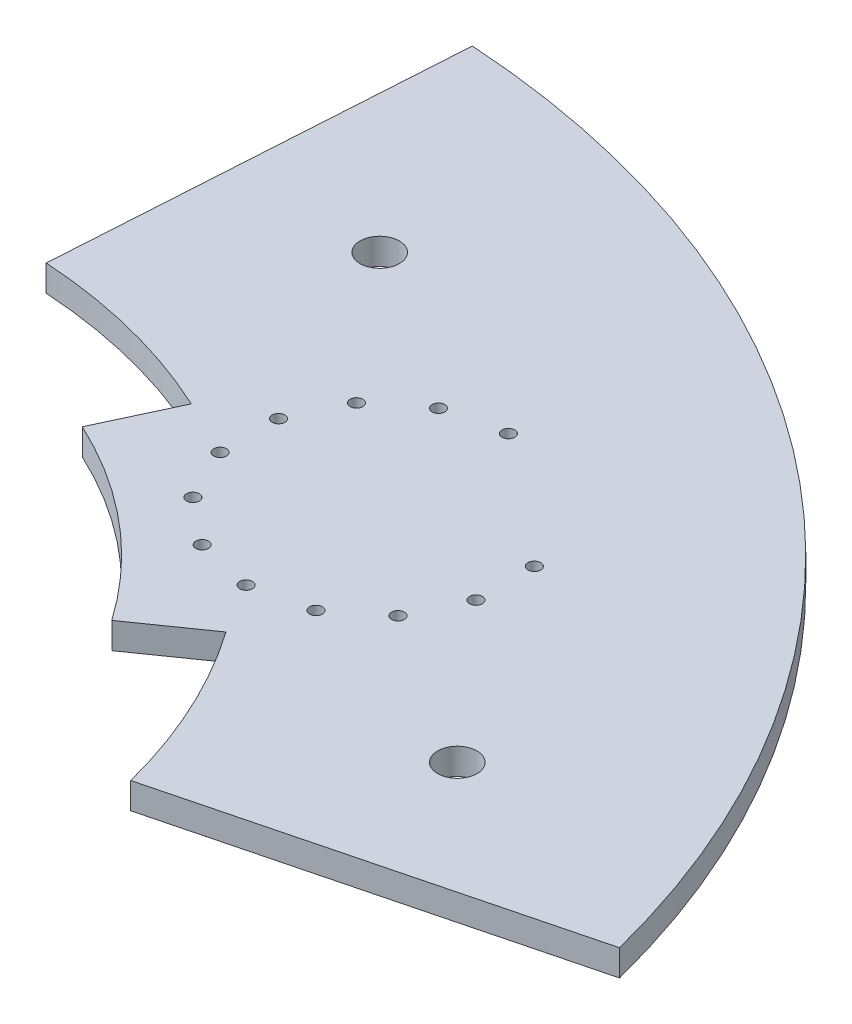
ISO-10303-21;
HEADER;
FILE_DESCRIPTION(('STEP AP214'),'2;1');
FILE_NAME('part.step','',(''),(''),'','','');
FILE_SCHEMA(('AUTOMOTIVE_DESIGN { 1 0 10303 214 1 1 1 1 }'));
ENDSEC;
DATA;
#1=APPLICATION_CONTEXT('core data for automotive mechanical design processes');
#2=APPLICATION_PROTOCOL_DEFINITION('international standard','automotive_design',2000,#1);
#3=PRODUCT_CONTEXT('',#1,'mechanical');
#4=PRODUCT('Part','Part','',(#3));
#5=PRODUCT_RELATED_PRODUCT_CATEGORY('part','',(#4));
#6=PRODUCT_DEFINITION_FORMATION('','',#4);
#7=PRODUCT_DEFINITION_CONTEXT('part definition',#1,'design');
#8=PRODUCT_DEFINITION('design','',#6,#7);
#9=PRODUCT_DEFINITION_SHAPE('','',#8);
#10=(LENGTH_UNIT() NAMED_UNIT(*) SI_UNIT(.MILLI.,.METRE.));
#11=(NAMED_UNIT(*) PLANE_ANGLE_UNIT() SI_UNIT($,.RADIAN.));
#12=(NAMED_UNIT(*) SI_UNIT($,.STERADIAN.) SOLID_ANGLE_UNIT());
#13=UNCERTAINTY_MEASURE_WITH_UNIT(LENGTH_MEASURE(1.E-05),#10,'distance_accuracy_value','');
#14=(GEOMETRIC_REPRESENTATION_CONTEXT(3) GLOBAL_UNCERTAINTY_ASSIGNED_CONTEXT((#13)) GLOBAL_UNIT_ASSIGNED_CONTEXT((#10,
#11,#12)) REPRESENTATION_CONTEXT('',''));
#15=CARTESIAN_POINT('',(0.,0.,0.));
#16=DIRECTION('',(0.,0.,1.));
#17=DIRECTION('',(1.,0.,0.));
#18=AXIS2_PLACEMENT_3D('',#15,#16,#17);
#19=CARTESIAN_POINT('',(-171.367875976404,1.6,83.6023855430664));
#20=DIRECTION('',(-0.247912182794819,0.,-0.968782508936814));
#21=DIRECTION('',(-0.968782508936814,0.,0.247912182794819));
#22=AXIS2_PLACEMENT_3D('',#19,#20,#21);
#23=PLANE('',#22);
#24=DIRECTION('',(0.968782508936814,0.,-0.247912182794819));
#25=VECTOR('',#24,1.);
#26=CARTESIAN_POINT('',(-171.367875976404,0.,83.6023855430664));
#27=LINE('',#26,#25);
#28=CARTESIAN_POINT('',(15.5239323843186,0.,35.7766292667422));
#29=VERTEX_POINT('',#28);
#30=CARTESIAN_POINT('',(39.2591038532706,0.,29.7027807882692));
#31=VERTEX_POINT('',#30);
#32=EDGE_CURVE('E133',#29,#31,#27,.T.);
#33=ORIENTED_EDGE('',*,*,#32,.T.);
#34=DIRECTION('',(0.,-1.,0.));
#35=VECTOR('',#34,1.);
#36=CARTESIAN_POINT('',(39.2591038532706,1.6,29.7027807882692));
#37=LINE('',#36,#35);
#38=CARTESIAN_POINT('',(39.2591038532706,1.6,29.7027807882692));
#39=VERTEX_POINT('',#38);
#40=EDGE_CURVE('E11',#39,#31,#37,.T.);
#41=ORIENTED_EDGE('',*,*,#40,.F.);
#42=DIRECTION('',(0.968782508936814,0.,-0.247912182794819));
#43=VECTOR('',#42,1.);
#44=CARTESIAN_POINT('',(-171.367875976404,1.6,83.6023855430664));
#45=LINE('',#44,#43);
#46=CARTESIAN_POINT('',(15.5239323843186,1.6,35.7766292667422));
#47=VERTEX_POINT('',#46);
#48=EDGE_CURVE('E154',#47,#39,#45,.T.);
#49=ORIENTED_EDGE('',*,*,#48,.F.);
#50=DIRECTION('',(0.,-1.,0.));
#51=VECTOR('',#50,1.);
#52=CARTESIAN_POINT('',(15.5239323843186,1.6,35.7766292667422));
#53=LINE('',#52,#51);
#54=EDGE_CURVE('E52',#47,#29,#53,.T.);
#55=ORIENTED_EDGE('',*,*,#54,.T.);
#56=EDGE_LOOP('',(#33,#41,#49,#55));
#57=FACE_BOUND('',#56,.T.);
#58=ADVANCED_FACE('F34',(#57),#23,.F.);
#59=CARTESIAN_POINT('',(-16.4458904105962,1.6,43.9577312989713));
#60=DIRECTION('',(0.,-1.,0.));
#61=DIRECTION('',(0.,0.,-1.));
#62=AXIS2_PLACEMENT_3D('',#59,#60,#61);
#63=CYLINDRICAL_SURFACE('',#62,57.5);
#64=CARTESIAN_POINT('',(-16.4458904105962,0.,43.9577312989713));
#65=DIRECTION('',(0.,1.,0.));
#66=DIRECTION('',(0.,0.,1.));
#67=AXIS2_PLACEMENT_3D('',#64,#65,#66);
#68=CIRCLE('',#67,57.5);
#69=CARTESIAN_POINT('',(-12.8492863399196,0.,-13.4296753261655));
#70=VERTEX_POINT('',#69);
#71=EDGE_CURVE('E135',#31,#70,#68,.T.);
#72=ORIENTED_EDGE('',*,*,#71,.T.);
#73=DIRECTION('',(0.,-1.,0.));
#74=VECTOR('',#73,1.);
#75=CARTESIAN_POINT('',(-12.8492863399196,1.6,-13.4296753261655));
#76=LINE('',#75,#74);
#77=CARTESIAN_POINT('',(-12.8492863399196,1.6,-13.4296753261655));
#78=VERTEX_POINT('',#77);
#79=EDGE_CURVE('E43',#78,#70,#76,.T.);
#80=ORIENTED_EDGE('',*,*,#79,.F.);
#81=CARTESIAN_POINT('',(-16.4458904105962,1.6,43.9577312989713));
#82=DIRECTION('',(0.,1.,0.));
#83=DIRECTION('',(0.,0.,1.));
#84=AXIS2_PLACEMENT_3D('',#81,#82,#83);
#85=CIRCLE('',#84,57.5);
#86=EDGE_CURVE('E90',#39,#78,#85,.T.);
#87=ORIENTED_EDGE('',*,*,#86,.F.);
#88=ORIENTED_EDGE('',*,*,#40,.T.);
#89=EDGE_LOOP('',(#72,#80,#87,#88));
#90=FACE_BOUND('',#89,.T.);
#91=ADVANCED_FACE('F272',(#90),#63,.T.);
#92=CARTESIAN_POINT('',(-11.6697764428041,1.6,-32.2499326450113));
#93=DIRECTION('',(-0.998041854350205,0.,-0.0625496360117667));
#94=DIRECTION('',(-0.0625496360117667,0.,0.998041854350205));
#95=AXIS2_PLACEMENT_3D('',#92,#93,#94);
#96=PLANE('',#95);
#97=DIRECTION('',(0.0625496360117667,0.,-0.998041854350205));
#98=VECTOR('',#97,1.);
#99=CARTESIAN_POINT('',(-11.6697764428041,0.,-32.2499326450113));
#100=LINE('',#99,#98);
#101=CARTESIAN_POINT('',(-14.3817524222079,0.,11.0223501054145));
#102=VERTEX_POINT('',#101);
#103=EDGE_CURVE('E139',#102,#70,#100,.T.);
#104=ORIENTED_EDGE('',*,*,#103,.F.);
#105=DIRECTION('',(0.,-1.,0.));
#106=VECTOR('',#105,1.);
#107=CARTESIAN_POINT('',(-14.3817524222079,1.6,11.0223501054145));
#108=LINE('',#107,#106);
#109=CARTESIAN_POINT('',(-14.3817524222079,1.6,11.0223501054145));
#110=VERTEX_POINT('',#109);
#111=EDGE_CURVE('E160',#110,#102,#108,.T.);
#112=ORIENTED_EDGE('',*,*,#111,.F.);
#113=DIRECTION('',(0.0625496360117667,0.,-0.998041854350205));
#114=VECTOR('',#113,1.);
#115=CARTESIAN_POINT('',(-11.6697764428041,1.6,-32.2499326450113));
#116=LINE('',#115,#114);
#117=EDGE_CURVE('E249',#110,#78,#116,.T.);
#118=ORIENTED_EDGE('',*,*,#117,.T.);
#119=ORIENTED_EDGE('',*,*,#79,.T.);
#120=EDGE_LOOP('',(#104,#112,#118,#119));
#121=FACE_BOUND('',#120,.T.);
#122=ADVANCED_FACE('F276',(#121),#96,.T.);
#123=CARTESIAN_POINT('',(-16.4458904105962,1.6,43.9577312989713));
#124=DIRECTION('',(0.,-1.,0.));
#125=DIRECTION('',(0.,0.,-1.));
#126=AXIS2_PLACEMENT_3D('',#123,#124,#125);
#127=CYLINDRICAL_SURFACE('',#126,33.);
#128=CARTESIAN_POINT('',(-16.4458904105962,0.,43.9577312989713));
#129=DIRECTION('',(0.,1.,0.));
#130=DIRECTION('',(0.,0.,1.));
#131=AXIS2_PLACEMENT_3D('',#128,#129,#130);
#132=CIRCLE('',#131,33.);
#133=CARTESIAN_POINT('',(-2.52245469045661,0.,14.0388754092963));
#134=VERTEX_POINT('',#133);
#135=EDGE_CURVE('E142',#134,#102,#132,.T.);
#136=ORIENTED_EDGE('',*,*,#135,.F.);
#137=DIRECTION('',(0.,-1.,0.));
#138=VECTOR('',#137,1.);
#139=CARTESIAN_POINT('',(-2.52245469045661,1.6,14.0388754092963));
#140=LINE('',#139,#138);
#141=CARTESIAN_POINT('',(-2.52245469045661,1.6,14.0388754092963));
#142=VERTEX_POINT('',#141);
#143=EDGE_CURVE('E158',#142,#134,#140,.T.);
#144=ORIENTED_EDGE('',*,*,#143,.F.);
#145=CARTESIAN_POINT('',(-16.4458904105962,1.6,43.9577312989713));
#146=DIRECTION('',(0.,1.,0.));
#147=DIRECTION('',(0.,0.,1.));
#148=AXIS2_PLACEMENT_3D('',#145,#146,#147);
#149=CIRCLE('',#148,33.);
#150=EDGE_CURVE('E252',#142,#110,#149,.T.);
#151=ORIENTED_EDGE('',*,*,#150,.T.);
#152=ORIENTED_EDGE('',*,*,#111,.T.);
#153=EDGE_LOOP('',(#136,#144,#151,#152));
#154=FACE_BOUND('',#153,.T.);
#155=ADVANCED_FACE('F282',(#154),#127,.F.);
#156=CARTESIAN_POINT('',(-16.0869998536748,1.6,43.1865427023831));
#157=DIRECTION('',(-0.906631996656817,0.,-0.421922294549687));
#158=DIRECTION('',(-0.421922294549688,0.,0.906631996656817));
#159=AXIS2_PLACEMENT_3D('',#156,#157,#158);
#160=PLANE('',#159);
#161=DIRECTION('',(0.421922294549688,0.,-0.906631996656817));
#162=VECTOR('',#161,1.);
#163=CARTESIAN_POINT('',(-16.0869998536748,0.,43.1865427023831));
#164=LINE('',#163,#162);
#165=CARTESIAN_POINT('',(-4.63206616320501,0.,18.5720353925804));
#166=VERTEX_POINT('',#165);
#167=EDGE_CURVE('E145',#166,#134,#164,.T.);
#168=ORIENTED_EDGE('',*,*,#167,.F.);
#169=DIRECTION('',(0.,-1.,0.));
#170=VECTOR('',#169,1.);
#171=CARTESIAN_POINT('',(-4.63206616320501,1.6,18.5720353925804));
#172=LINE('',#171,#170);
#173=CARTESIAN_POINT('',(-4.63206616320501,1.6,18.5720353925804));
#174=VERTEX_POINT('',#173);
#175=EDGE_CURVE('E115',#174,#166,#172,.T.);
#176=ORIENTED_EDGE('',*,*,#175,.F.);
#177=DIRECTION('',(0.421922294549688,0.,-0.906631996656817));
#178=VECTOR('',#177,1.);
#179=CARTESIAN_POINT('',(-16.0869998536748,1.6,43.1865427023831));
#180=LINE('',#179,#178);
#181=EDGE_CURVE('E125',#174,#142,#180,.T.);
#182=ORIENTED_EDGE('',*,*,#181,.T.);
#183=ORIENTED_EDGE('',*,*,#143,.T.);
#184=EDGE_LOOP('',(#168,#176,#182,#183));
#185=FACE_BOUND('',#184,.T.);
#186=ADVANCED_FACE('F256',(#185),#160,.T.);
#187=CARTESIAN_POINT('',(-16.4458904105962,1.6,43.9577312989713));
#188=DIRECTION('',(0.,-1.,0.));
#189=DIRECTION('',(0.,0.,-1.));
#190=AXIS2_PLACEMENT_3D('',#187,#188,#189);
#191=CYLINDRICAL_SURFACE('',#190,28.);
#192=CARTESIAN_POINT('',(-16.4458904105962,0.,43.9577312989713));
#193=DIRECTION('',(0.,1.,0.));
#194=DIRECTION('',(0.,0.,1.));
#195=AXIS2_PLACEMENT_3D('',#192,#193,#194);
#196=CIRCLE('',#195,28.);
#197=CARTESIAN_POINT('',(6.49036682949548,0.,27.897591081142));
#198=VERTEX_POINT('',#197);
#199=EDGE_CURVE('E111',#198,#166,#196,.T.);
#200=ORIENTED_EDGE('',*,*,#199,.F.);
#201=DIRECTION('',(0.,-1.,0.));
#202=VECTOR('',#201,1.);
#203=CARTESIAN_POINT('',(6.49036682949548,1.6,27.897591081142));
#204=LINE('',#203,#202);
#205=CARTESIAN_POINT('',(6.49036682949548,1.6,27.897591081142));
#206=VERTEX_POINT('',#205);
#207=EDGE_CURVE('E106',#206,#198,#204,.T.);
#208=ORIENTED_EDGE('',*,*,#207,.F.);
#209=CARTESIAN_POINT('',(-16.4458904105962,1.6,43.9577312989713));
#210=DIRECTION('',(0.,1.,0.));
#211=DIRECTION('',(0.,0.,1.));
#212=AXIS2_PLACEMENT_3D('',#209,#210,#211);
#213=CIRCLE('',#212,28.);
#214=EDGE_CURVE('E109',#206,#174,#213,.T.);
#215=ORIENTED_EDGE('',*,*,#214,.T.);
#216=ORIENTED_EDGE('',*,*,#175,.T.);
#217=EDGE_LOOP('',(#200,#208,#215,#216));
#218=FACE_BOUND('',#217,.T.);
#219=ADVANCED_FACE('F108',(#218),#191,.F.);
#220=CARTESIAN_POINT('',(-100.891914518849,1.6,103.087473951408));
#221=DIRECTION('',(0.573576436351044,0.,0.819152044288993));
#222=DIRECTION('',(0.819152044288993,0.,-0.573576436351044));
#223=AXIS2_PLACEMENT_3D('',#220,#221,#222);
#224=PLANE('',#223);
#225=DIRECTION('',(-0.819152044288993,0.,0.573576436351044));
#226=VECTOR('',#225,1.);
#227=CARTESIAN_POINT('',(-100.891914518849,0.,103.087473951408));
#228=LINE('',#227,#226);
#229=CARTESIAN_POINT('',(10.5861270509405,0.,25.0297088993867));
#230=VERTEX_POINT('',#229);
#231=EDGE_CURVE('E149',#230,#198,#228,.T.);
#232=ORIENTED_EDGE('',*,*,#231,.F.);
#233=DIRECTION('',(0.,-1.,0.));
#234=VECTOR('',#233,1.);
#235=CARTESIAN_POINT('',(10.5861270509405,1.6,25.0297088993867));
#236=LINE('',#235,#234);
#237=CARTESIAN_POINT('',(10.5861270509405,1.6,25.0297088993867));
#238=VERTEX_POINT('',#237);
#239=EDGE_CURVE('E78',#238,#230,#236,.T.);
#240=ORIENTED_EDGE('',*,*,#239,.F.);
#241=DIRECTION('',(-0.819152044288993,0.,0.573576436351044));
#242=VECTOR('',#241,1.);
#243=CARTESIAN_POINT('',(-100.891914518849,1.6,103.087473951408));
#244=LINE('',#243,#242);
#245=EDGE_CURVE('E122',#238,#206,#244,.T.);
#246=ORIENTED_EDGE('',*,*,#245,.T.);
#247=ORIENTED_EDGE('',*,*,#207,.T.);
#248=EDGE_LOOP('',(#232,#240,#246,#247));
#249=FACE_BOUND('',#248,.T.);
#250=ADVANCED_FACE('F127',(#249),#224,.T.);
#251=CARTESIAN_POINT('',(-16.4458904105962,1.6,43.9577312989713));
#252=DIRECTION('',(0.,-1.,0.));
#253=DIRECTION('',(0.,0.,-1.));
#254=AXIS2_PLACEMENT_3D('',#251,#252,#253);
#255=CYLINDRICAL_SURFACE('',#254,33.);
#256=CARTESIAN_POINT('',(-16.4458904105962,0.,43.9577312989713));
#257=DIRECTION('',(0.,1.,0.));
#258=DIRECTION('',(0.,0.,1.));
#259=AXIS2_PLACEMENT_3D('',#256,#257,#258);
#260=CIRCLE('',#259,33.);
#261=EDGE_CURVE('E151',#29,#230,#260,.T.);
#262=ORIENTED_EDGE('',*,*,#261,.F.);
#263=ORIENTED_EDGE('',*,*,#54,.F.);
#264=CARTESIAN_POINT('',(-16.4458904105962,1.6,43.9577312989713));
#265=DIRECTION('',(0.,1.,0.));
#266=DIRECTION('',(0.,0.,1.));
#267=AXIS2_PLACEMENT_3D('',#264,#265,#266);
#268=CIRCLE('',#267,33.);
#269=EDGE_CURVE('E128',#47,#238,#268,.T.);
#270=ORIENTED_EDGE('',*,*,#269,.T.);
#271=ORIENTED_EDGE('',*,*,#239,.T.);
#272=EDGE_LOOP('',(#262,#263,#270,#271));
#273=FACE_BOUND('',#272,.T.);
#274=ADVANCED_FACE('F260',(#273),#255,.F.);
#275=CARTESIAN_POINT('',(-204.100762242655,1.6,-44.3100362034965));
#276=DIRECTION('',(0.,1.,0.));
#277=DIRECTION('',(0.,0.,1.));
#278=AXIS2_PLACEMENT_3D('',#275,#276,#277);
#279=PLANE('',#278);
#280=CARTESIAN_POINT('',(16.5212877399962,1.6,12.1604070723523));
#281=DIRECTION('',(0.,1.,0.));
#282=DIRECTION('',(0.,0.,1.));
#283=AXIS2_PLACEMENT_3D('',#280,#281,#282);
#284=CIRCLE('',#283,0.390000000000001);
#285=CARTESIAN_POINT('',(16.5212877399962,1.6,12.5504070723523));
#286=VERTEX_POINT('',#285);
#287=EDGE_CURVE('E221',#286,#286,#284,.T.);
#288=ORIENTED_EDGE('',*,*,#287,.F.);
#289=EDGE_LOOP('',(#288));
#290=FACE_BOUND('',#289,.T.);
#291=CARTESIAN_POINT('',(16.5212877399963,1.6,15.7207420156533));
#292=DIRECTION('',(0.,1.,0.));
#293=DIRECTION('',(0.,0.,1.));
#294=AXIS2_PLACEMENT_3D('',#291,#292,#293);
#295=CIRCLE('',#294,0.390000000000001);
#296=CARTESIAN_POINT('',(16.5212877399963,1.6,16.1107420156533));
#297=VERTEX_POINT('',#296);
#298=EDGE_CURVE('E211',#297,#297,#295,.T.);
#299=ORIENTED_EDGE('',*,*,#298,.F.);
#300=EDGE_LOOP('',(#299));
#301=FACE_BOUND('',#300,.T.);
#302=CARTESIAN_POINT('',(14.9765163022859,1.6,18.9284929588727));
#303=DIRECTION('',(0.,1.,0.));
#304=DIRECTION('',(0.,0.,1.));
#305=AXIS2_PLACEMENT_3D('',#302,#303,#304);
#306=CIRCLE('',#305,0.390000000000001);
#307=CARTESIAN_POINT('',(14.9765163022859,1.6,19.3184929588727));
#308=VERTEX_POINT('',#307);
#309=EDGE_CURVE('E208',#308,#308,#306,.T.);
#310=ORIENTED_EDGE('',*,*,#309,.F.);
#311=EDGE_LOOP('',(#310));
#312=FACE_BOUND('',#311,.T.);
#313=CARTESIAN_POINT('',(12.1929343554822,1.6,21.1483254872222));
#314=DIRECTION('',(0.,1.,0.));
#315=DIRECTION('',(0.,0.,1.));
#316=AXIS2_PLACEMENT_3D('',#313,#314,#315);
#317=CIRCLE('',#316,0.389999999999999);
#318=CARTESIAN_POINT('',(12.1929343554822,1.6,21.5383254872222));
#319=VERTEX_POINT('',#318);
#320=EDGE_CURVE('E205',#319,#319,#317,.T.);
#321=ORIENTED_EDGE('',*,*,#320,.F.);
#322=EDGE_LOOP('',(#321));
#323=FACE_BOUND('',#322,.T.);
#324=CARTESIAN_POINT('',(8.72186444254172,1.6,21.9405745440029));
#325=DIRECTION('',(0.,1.,0.));
#326=DIRECTION('',(0.,0.,1.));
#327=AXIS2_PLACEMENT_3D('',#324,#325,#326);
#328=CIRCLE('',#327,0.389999999999999);
#329=CARTESIAN_POINT('',(8.72186444254172,1.6,22.3305745440029));
#330=VERTEX_POINT('',#329);
#331=EDGE_CURVE('E201',#330,#330,#328,.T.);
#332=ORIENTED_EDGE('',*,*,#331,.F.);
#333=EDGE_LOOP('',(#332));
#334=FACE_BOUND('',#333,.T.);
#335=CARTESIAN_POINT('',(5.25079452960124,1.6,21.1483254872223));
#336=DIRECTION('',(0.,1.,0.));
#337=DIRECTION('',(0.,0.,1.));
#338=AXIS2_PLACEMENT_3D('',#335,#336,#337);
#339=CIRCLE('',#338,0.39);
#340=CARTESIAN_POINT('',(5.25079452960124,1.6,21.5383254872223));
#341=VERTEX_POINT('',#340);
#342=EDGE_CURVE('E197',#341,#341,#339,.T.);
#343=ORIENTED_EDGE('',*,*,#342,.F.);
#344=EDGE_LOOP('',(#343));
#345=FACE_BOUND('',#344,.T.);
#346=CARTESIAN_POINT('',(2.46721258279745,1.6,18.9284929588728));
#347=DIRECTION('',(0.,1.,0.));
#348=DIRECTION('',(0.,0.,1.));
#349=AXIS2_PLACEMENT_3D('',#346,#347,#348);
#350=CIRCLE('',#349,0.389999999999998);
#351=CARTESIAN_POINT('',(2.46721258279745,1.6,19.3184929588728));
#352=VERTEX_POINT('',#351);
#353=EDGE_CURVE('E193',#352,#352,#350,.T.);
#354=ORIENTED_EDGE('',*,*,#353,.F.);
#355=EDGE_LOOP('',(#354));
#356=FACE_BOUND('',#355,.T.);
#357=CARTESIAN_POINT('',(0.922441145087082,1.6,15.7207420156534));
#358=DIRECTION('',(0.,1.,0.));
#359=DIRECTION('',(0.,0.,1.));
#360=AXIS2_PLACEMENT_3D('',#357,#358,#359);
#361=CIRCLE('',#360,0.39);
#362=CARTESIAN_POINT('',(0.922441145087082,1.6,16.1107420156534));
#363=VERTEX_POINT('',#362);
#364=EDGE_CURVE('E189',#363,#363,#361,.T.);
#365=ORIENTED_EDGE('',*,*,#364,.F.);
#366=EDGE_LOOP('',(#365));
#367=FACE_BOUND('',#366,.T.);
#368=CARTESIAN_POINT('',(0.92244114508707,1.6,12.1604070723524));
#369=DIRECTION('',(0.,1.,0.));
#370=DIRECTION('',(0.,0.,1.));
#371=AXIS2_PLACEMENT_3D('',#368,#369,#370);
#372=CIRCLE('',#371,0.39);
#373=CARTESIAN_POINT('',(0.92244114508707,1.6,12.5504070723524));
#374=VERTEX_POINT('',#373);
#375=EDGE_CURVE('E185',#374,#374,#372,.T.);
#376=ORIENTED_EDGE('',*,*,#375,.F.);
#377=EDGE_LOOP('',(#376));
#378=FACE_BOUND('',#377,.T.);
#379=CARTESIAN_POINT('',(2.46721258279741,1.6,8.95265612913302));
#380=DIRECTION('',(0.,1.,0.));
#381=DIRECTION('',(0.,0.,1.));
#382=AXIS2_PLACEMENT_3D('',#379,#380,#381);
#383=CIRCLE('',#382,0.389999999999999);
#384=CARTESIAN_POINT('',(2.46721258279741,1.6,9.34265612913302));
#385=VERTEX_POINT('',#384);
#386=EDGE_CURVE('E181',#385,#385,#383,.T.);
#387=ORIENTED_EDGE('',*,*,#386,.F.);
#388=EDGE_LOOP('',(#387));
#389=FACE_BOUND('',#388,.T.);
#390=CARTESIAN_POINT('',(5.25079452960119,1.6,6.73282360078353));
#391=DIRECTION('',(0.,1.,0.));
#392=DIRECTION('',(0.,0.,1.));
#393=AXIS2_PLACEMENT_3D('',#390,#391,#392);
#394=CIRCLE('',#393,0.389999999999998);
#395=CARTESIAN_POINT('',(5.25079452960119,1.6,7.12282360078353));
#396=VERTEX_POINT('',#395);
#397=EDGE_CURVE('E177',#396,#396,#394,.T.);
#398=ORIENTED_EDGE('',*,*,#397,.F.);
#399=EDGE_LOOP('',(#398));
#400=FACE_BOUND('',#399,.T.);
#401=CARTESIAN_POINT('',(8.72186444254167,1.6,5.94057454400288));
#402=DIRECTION('',(0.,1.,0.));
#403=DIRECTION('',(0.,0.,1.));
#404=AXIS2_PLACEMENT_3D('',#401,#402,#403);
#405=CIRCLE('',#404,0.39);
#406=CARTESIAN_POINT('',(8.72186444254167,1.6,6.33057454400288));
#407=VERTEX_POINT('',#406);
#408=EDGE_CURVE('E173',#407,#407,#405,.T.);
#409=ORIENTED_EDGE('',*,*,#408,.F.);
#410=EDGE_LOOP('',(#409));
#411=FACE_BOUND('',#410,.T.);
#412=CARTESIAN_POINT('',(24.5192215634603,1.6,24.8553858682916));
#413=DIRECTION('',(0.,1.,0.));
#414=DIRECTION('',(0.,0.,1.));
#415=AXIS2_PLACEMENT_3D('',#412,#413,#414);
#416=CIRCLE('',#415,1.2);
#417=CARTESIAN_POINT('',(24.5192215634603,1.6,26.0553858682916));
#418=VERTEX_POINT('',#417);
#419=EDGE_CURVE('E169',#418,#418,#416,.T.);
#420=ORIENTED_EDGE('',*,*,#419,.F.);
#421=EDGE_LOOP('',(#420));
#422=FACE_BOUND('',#421,.T.);
#423=CARTESIAN_POINT('',(-4.78079406370877,1.6,0.288914882472981));
#424=DIRECTION('',(0.,1.,0.));
#425=DIRECTION('',(0.,0.,1.));
#426=AXIS2_PLACEMENT_3D('',#423,#424,#425);
#427=CIRCLE('',#426,1.2);
#428=CARTESIAN_POINT('',(-4.78079406370877,1.6,1.48891488247298));
#429=VERTEX_POINT('',#428);
#430=EDGE_CURVE('E165',#429,#429,#427,.T.);
#431=ORIENTED_EDGE('',*,*,#430,.F.);
#432=EDGE_LOOP('',(#431));
#433=FACE_BOUND('',#432,.T.);
#434=ORIENTED_EDGE('',*,*,#48,.T.);
#435=ORIENTED_EDGE('',*,*,#86,.T.);
#436=ORIENTED_EDGE('',*,*,#117,.F.);
#437=ORIENTED_EDGE('',*,*,#150,.F.);
#438=ORIENTED_EDGE('',*,*,#181,.F.);
#439=ORIENTED_EDGE('',*,*,#214,.F.);
#440=ORIENTED_EDGE('',*,*,#245,.F.);
#441=ORIENTED_EDGE('',*,*,#269,.F.);
#442=EDGE_LOOP('',(#434,#435,#436,#437,#438,#439,#440,#441));
#443=FACE_BOUND('',#442,.T.);
#444=ADVANCED_FACE('F120',(#290,#301,#312,#323,#334,#345,#356,#367,#378,#389,#400,#411,#422,
#433,#443),#279,.T.);
#445=CARTESIAN_POINT('',(-204.100762242655,0.,-44.3100362034965));
#446=DIRECTION('',(0.,1.,0.));
#447=DIRECTION('',(0.,0.,1.));
#448=AXIS2_PLACEMENT_3D('',#445,#446,#447);
#449=PLANE('',#448);
#450=CARTESIAN_POINT('',(16.5212877399962,0.,12.1604070723523));
#451=DIRECTION('',(0.,1.,0.));
#452=DIRECTION('',(0.,0.,1.));
#453=AXIS2_PLACEMENT_3D('',#450,#451,#452);
#454=CIRCLE('',#453,0.390000000000001);
#455=CARTESIAN_POINT('',(16.5212877399962,0.,12.5504070723523));
#456=VERTEX_POINT('',#455);
#457=EDGE_CURVE('E37',#456,#456,#454,.T.);
#458=ORIENTED_EDGE('',*,*,#457,.T.);
#459=EDGE_LOOP('',(#458));
#460=FACE_BOUND('',#459,.T.);
#461=CARTESIAN_POINT('',(16.5212877399963,0.,15.7207420156533));
#462=DIRECTION('',(0.,1.,0.));
#463=DIRECTION('',(0.,0.,1.));
#464=AXIS2_PLACEMENT_3D('',#461,#462,#463);
#465=CIRCLE('',#464,0.390000000000001);
#466=CARTESIAN_POINT('',(16.5212877399963,0.,16.1107420156533));
#467=VERTEX_POINT('',#466);
#468=EDGE_CURVE('E209',#467,#467,#465,.T.);
#469=ORIENTED_EDGE('',*,*,#468,.T.);
#470=EDGE_LOOP('',(#469));
#471=FACE_BOUND('',#470,.T.);
#472=CARTESIAN_POINT('',(14.9765163022859,0.,18.9284929588727));
#473=DIRECTION('',(0.,1.,0.));
#474=DIRECTION('',(0.,0.,1.));
#475=AXIS2_PLACEMENT_3D('',#472,#473,#474);
#476=CIRCLE('',#475,0.390000000000001);
#477=CARTESIAN_POINT('',(14.9765163022859,0.,19.3184929588727));
#478=VERTEX_POINT('',#477);
#479=EDGE_CURVE('E206',#478,#478,#476,.T.);
#480=ORIENTED_EDGE('',*,*,#479,.T.);
#481=EDGE_LOOP('',(#480));
#482=FACE_BOUND('',#481,.T.);
#483=CARTESIAN_POINT('',(12.1929343554822,0.,21.1483254872222));
#484=DIRECTION('',(0.,1.,0.));
#485=DIRECTION('',(0.,0.,1.));
#486=AXIS2_PLACEMENT_3D('',#483,#484,#485);
#487=CIRCLE('',#486,0.389999999999999);
#488=CARTESIAN_POINT('',(12.1929343554822,0.,21.5383254872222));
#489=VERTEX_POINT('',#488);
#490=EDGE_CURVE('E202',#489,#489,#487,.T.);
#491=ORIENTED_EDGE('',*,*,#490,.T.);
#492=EDGE_LOOP('',(#491));
#493=FACE_BOUND('',#492,.T.);
#494=CARTESIAN_POINT('',(8.72186444254172,0.,21.9405745440029));
#495=DIRECTION('',(0.,1.,0.));
#496=DIRECTION('',(0.,0.,1.));
#497=AXIS2_PLACEMENT_3D('',#494,#495,#496);
#498=CIRCLE('',#497,0.389999999999999);
#499=CARTESIAN_POINT('',(8.72186444254172,0.,22.3305745440029));
#500=VERTEX_POINT('',#499);
#501=EDGE_CURVE('E198',#500,#500,#498,.T.);
#502=ORIENTED_EDGE('',*,*,#501,.T.);
#503=EDGE_LOOP('',(#502));
#504=FACE_BOUND('',#503,.T.);
#505=CARTESIAN_POINT('',(5.25079452960124,0.,21.1483254872223));
#506=DIRECTION('',(0.,1.,0.));
#507=DIRECTION('',(0.,0.,1.));
#508=AXIS2_PLACEMENT_3D('',#505,#506,#507);
#509=CIRCLE('',#508,0.39);
#510=CARTESIAN_POINT('',(5.25079452960124,0.,21.5383254872223));
#511=VERTEX_POINT('',#510);
#512=EDGE_CURVE('E194',#511,#511,#509,.T.);
#513=ORIENTED_EDGE('',*,*,#512,.T.);
#514=EDGE_LOOP('',(#513));
#515=FACE_BOUND('',#514,.T.);
#516=CARTESIAN_POINT('',(2.46721258279745,0.,18.9284929588728));
#517=DIRECTION('',(0.,1.,0.));
#518=DIRECTION('',(0.,0.,1.));
#519=AXIS2_PLACEMENT_3D('',#516,#517,#518);
#520=CIRCLE('',#519,0.389999999999998);
#521=CARTESIAN_POINT('',(2.46721258279745,0.,19.3184929588728));
#522=VERTEX_POINT('',#521);
#523=EDGE_CURVE('E190',#522,#522,#520,.T.);
#524=ORIENTED_EDGE('',*,*,#523,.T.);
#525=EDGE_LOOP('',(#524));
#526=FACE_BOUND('',#525,.T.);
#527=CARTESIAN_POINT('',(0.922441145087082,0.,15.7207420156534));
#528=DIRECTION('',(0.,1.,0.));
#529=DIRECTION('',(0.,0.,1.));
#530=AXIS2_PLACEMENT_3D('',#527,#528,#529);
#531=CIRCLE('',#530,0.39);
#532=CARTESIAN_POINT('',(0.922441145087082,0.,16.1107420156534));
#533=VERTEX_POINT('',#532);
#534=EDGE_CURVE('E186',#533,#533,#531,.T.);
#535=ORIENTED_EDGE('',*,*,#534,.T.);
#536=EDGE_LOOP('',(#535));
#537=FACE_BOUND('',#536,.T.);
#538=CARTESIAN_POINT('',(0.92244114508707,0.,12.1604070723524));
#539=DIRECTION('',(0.,1.,0.));
#540=DIRECTION('',(0.,0.,1.));
#541=AXIS2_PLACEMENT_3D('',#538,#539,#540);
#542=CIRCLE('',#541,0.39);
#543=CARTESIAN_POINT('',(0.92244114508707,0.,12.5504070723524));
#544=VERTEX_POINT('',#543);
#545=EDGE_CURVE('E182',#544,#544,#542,.T.);
#546=ORIENTED_EDGE('',*,*,#545,.T.);
#547=EDGE_LOOP('',(#546));
#548=FACE_BOUND('',#547,.T.);
#549=CARTESIAN_POINT('',(2.46721258279741,0.,8.95265612913302));
#550=DIRECTION('',(0.,1.,0.));
#551=DIRECTION('',(0.,0.,1.));
#552=AXIS2_PLACEMENT_3D('',#549,#550,#551);
#553=CIRCLE('',#552,0.389999999999999);
#554=CARTESIAN_POINT('',(2.46721258279741,0.,9.34265612913302));
#555=VERTEX_POINT('',#554);
#556=EDGE_CURVE('E178',#555,#555,#553,.T.);
#557=ORIENTED_EDGE('',*,*,#556,.T.);
#558=EDGE_LOOP('',(#557));
#559=FACE_BOUND('',#558,.T.);
#560=CARTESIAN_POINT('',(5.25079452960119,0.,6.73282360078353));
#561=DIRECTION('',(0.,1.,0.));
#562=DIRECTION('',(0.,0.,1.));
#563=AXIS2_PLACEMENT_3D('',#560,#561,#562);
#564=CIRCLE('',#563,0.389999999999998);
#565=CARTESIAN_POINT('',(5.25079452960119,0.,7.12282360078353));
#566=VERTEX_POINT('',#565);
#567=EDGE_CURVE('E174',#566,#566,#564,.T.);
#568=ORIENTED_EDGE('',*,*,#567,.T.);
#569=EDGE_LOOP('',(#568));
#570=FACE_BOUND('',#569,.T.);
#571=CARTESIAN_POINT('',(8.72186444254167,0.,5.94057454400288));
#572=DIRECTION('',(0.,1.,0.));
#573=DIRECTION('',(0.,0.,1.));
#574=AXIS2_PLACEMENT_3D('',#571,#572,#573);
#575=CIRCLE('',#574,0.39);
#576=CARTESIAN_POINT('',(8.72186444254167,0.,6.33057454400288));
#577=VERTEX_POINT('',#576);
#578=EDGE_CURVE('E170',#577,#577,#575,.T.);
#579=ORIENTED_EDGE('',*,*,#578,.T.);
#580=EDGE_LOOP('',(#579));
#581=FACE_BOUND('',#580,.T.);
#582=CARTESIAN_POINT('',(24.5192215634603,0.,24.8553858682916));
#583=DIRECTION('',(0.,1.,0.));
#584=DIRECTION('',(0.,0.,1.));
#585=AXIS2_PLACEMENT_3D('',#582,#583,#584);
#586=CIRCLE('',#585,1.2);
#587=CARTESIAN_POINT('',(24.5192215634603,0.,26.0553858682916));
#588=VERTEX_POINT('',#587);
#589=EDGE_CURVE('E166',#588,#588,#586,.T.);
#590=ORIENTED_EDGE('',*,*,#589,.T.);
#591=EDGE_LOOP('',(#590));
#592=FACE_BOUND('',#591,.T.);
#593=CARTESIAN_POINT('',(-4.78079406370877,0.,0.288914882472981));
#594=DIRECTION('',(0.,1.,0.));
#595=DIRECTION('',(0.,0.,1.));
#596=AXIS2_PLACEMENT_3D('',#593,#594,#595);
#597=CIRCLE('',#596,1.2);
#598=CARTESIAN_POINT('',(-4.78079406370877,0.,1.48891488247298));
#599=VERTEX_POINT('',#598);
#600=EDGE_CURVE('E136',#599,#599,#597,.T.);
#601=ORIENTED_EDGE('',*,*,#600,.T.);
#602=EDGE_LOOP('',(#601));
#603=FACE_BOUND('',#602,.T.);
#604=CARTESIAN_POINT('',(8.72186444254164,0.,13.9405745440028));
#605=DIRECTION('',(0.,1.,0.));
#606=DIRECTION('',(0.,0.,1.));
#607=AXIS2_PLACEMENT_3D('',#604,#605,#606);
#608=CIRCLE('',#607,4.99999999999995);
#609=CARTESIAN_POINT('',(8.72186444254164,0.,18.9405745440028));
#610=VERTEX_POINT('',#609);
#611=EDGE_CURVE('E490',#610,#610,#608,.T.);
#612=ORIENTED_EDGE('',*,*,#611,.T.);
#613=EDGE_LOOP('',(#612));
#614=FACE_BOUND('',#613,.T.);
#615=ORIENTED_EDGE('',*,*,#32,.F.);
#616=ORIENTED_EDGE('',*,*,#261,.T.);
#617=ORIENTED_EDGE('',*,*,#231,.T.);
#618=ORIENTED_EDGE('',*,*,#199,.T.);
#619=ORIENTED_EDGE('',*,*,#167,.T.);
#620=ORIENTED_EDGE('',*,*,#135,.T.);
#621=ORIENTED_EDGE('',*,*,#103,.T.);
#622=ORIENTED_EDGE('',*,*,#71,.F.);
#623=EDGE_LOOP('',(#615,#616,#617,#618,#619,#620,#621,#622));
#624=FACE_BOUND('',#623,.T.);
#625=ADVANCED_FACE('F259',(#460,#471,#482,#493,#504,#515,#526,#537,#548,#559,#570,#581,#592,
#603,#614,#624),#449,.F.);
#626=CARTESIAN_POINT('',(-4.78079406370877,-0.1,0.288914882472981));
#627=DIRECTION('',(0.,1.,0.));
#628=DIRECTION('',(0.,0.,1.));
#629=AXIS2_PLACEMENT_3D('',#626,#627,#628);
#630=CYLINDRICAL_SURFACE('',#629,1.2);
#631=ORIENTED_EDGE('',*,*,#430,.T.);
#632=EDGE_LOOP('',(#631));
#633=FACE_BOUND('',#632,.T.);
#634=ORIENTED_EDGE('',*,*,#600,.F.);
#635=EDGE_LOOP('',(#634));
#636=FACE_BOUND('',#635,.T.);
#637=ADVANCED_FACE('F312',(#633,#636),#630,.F.);
#638=CARTESIAN_POINT('',(24.5192215634603,-0.1,24.8553858682916));
#639=DIRECTION('',(0.,1.,0.));
#640=DIRECTION('',(0.,0.,1.));
#641=AXIS2_PLACEMENT_3D('',#638,#639,#640);
#642=CYLINDRICAL_SURFACE('',#641,1.2);
#643=ORIENTED_EDGE('',*,*,#419,.T.);
#644=EDGE_LOOP('',(#643));
#645=FACE_BOUND('',#644,.T.);
#646=ORIENTED_EDGE('',*,*,#589,.F.);
#647=EDGE_LOOP('',(#646));
#648=FACE_BOUND('',#647,.T.);
#649=ADVANCED_FACE('F317',(#645,#648),#642,.F.);
#650=CARTESIAN_POINT('',(8.72186444254167,-8.4,5.94057454400288));
#651=DIRECTION('',(0.,1.,0.));
#652=DIRECTION('',(0.,0.,1.));
#653=AXIS2_PLACEMENT_3D('',#650,#651,#652);
#654=CYLINDRICAL_SURFACE('',#653,0.39);
#655=ORIENTED_EDGE('',*,*,#408,.T.);
#656=EDGE_LOOP('',(#655));
#657=FACE_BOUND('',#656,.T.);
#658=ORIENTED_EDGE('',*,*,#578,.F.);
#659=EDGE_LOOP('',(#658));
#660=FACE_BOUND('',#659,.T.);
#661=ADVANCED_FACE('F329',(#657,#660),#654,.F.);
#662=CARTESIAN_POINT('',(5.25079452960119,-8.4,6.73282360078353));
#663=DIRECTION('',(0.,1.,0.));
#664=DIRECTION('',(0.,0.,1.));
#665=AXIS2_PLACEMENT_3D('',#662,#663,#664);
#666=CYLINDRICAL_SURFACE('',#665,0.389999999999998);
#667=ORIENTED_EDGE('',*,*,#397,.T.);
#668=EDGE_LOOP('',(#667));
#669=FACE_BOUND('',#668,.T.);
#670=ORIENTED_EDGE('',*,*,#567,.F.);
#671=EDGE_LOOP('',(#670));
#672=FACE_BOUND('',#671,.T.);
#673=ADVANCED_FACE('F345',(#669,#672),#666,.F.);
#674=CARTESIAN_POINT('',(2.46721258279741,-8.4,8.95265612913302));
#675=DIRECTION('',(0.,1.,0.));
#676=DIRECTION('',(0.,0.,1.));
#677=AXIS2_PLACEMENT_3D('',#674,#675,#676);
#678=CYLINDRICAL_SURFACE('',#677,0.389999999999999);
#679=ORIENTED_EDGE('',*,*,#386,.T.);
#680=EDGE_LOOP('',(#679));
#681=FACE_BOUND('',#680,.T.);
#682=ORIENTED_EDGE('',*,*,#556,.F.);
#683=EDGE_LOOP('',(#682));
#684=FACE_BOUND('',#683,.T.);
#685=ADVANCED_FACE('F355',(#681,#684),#678,.F.);
#686=CARTESIAN_POINT('',(0.92244114508707,-8.4,12.1604070723524));
#687=DIRECTION('',(0.,1.,0.));
#688=DIRECTION('',(0.,0.,1.));
#689=AXIS2_PLACEMENT_3D('',#686,#687,#688);
#690=CYLINDRICAL_SURFACE('',#689,0.39);
#691=ORIENTED_EDGE('',*,*,#375,.T.);
#692=EDGE_LOOP('',(#691));
#693=FACE_BOUND('',#692,.T.);
#694=ORIENTED_EDGE('',*,*,#545,.F.);
#695=EDGE_LOOP('',(#694));
#696=FACE_BOUND('',#695,.T.);
#697=ADVANCED_FACE('F365',(#693,#696),#690,.F.);
#698=CARTESIAN_POINT('',(0.922441145087082,-8.4,15.7207420156534));
#699=DIRECTION('',(0.,1.,0.));
#700=DIRECTION('',(0.,0.,1.));
#701=AXIS2_PLACEMENT_3D('',#698,#699,#700);
#702=CYLINDRICAL_SURFACE('',#701,0.39);
#703=ORIENTED_EDGE('',*,*,#364,.T.);
#704=EDGE_LOOP('',(#703));
#705=FACE_BOUND('',#704,.T.);
#706=ORIENTED_EDGE('',*,*,#534,.F.);
#707=EDGE_LOOP('',(#706));
#708=FACE_BOUND('',#707,.T.);
#709=ADVANCED_FACE('F375',(#705,#708),#702,.F.);
#710=CARTESIAN_POINT('',(2.46721258279745,-8.4,18.9284929588728));
#711=DIRECTION('',(0.,1.,0.));
#712=DIRECTION('',(0.,0.,1.));
#713=AXIS2_PLACEMENT_3D('',#710,#711,#712);
#714=CYLINDRICAL_SURFACE('',#713,0.389999999999998);
#715=ORIENTED_EDGE('',*,*,#353,.T.);
#716=EDGE_LOOP('',(#715));
#717=FACE_BOUND('',#716,.T.);
#718=ORIENTED_EDGE('',*,*,#523,.F.);
#719=EDGE_LOOP('',(#718));
#720=FACE_BOUND('',#719,.T.);
#721=ADVANCED_FACE('F385',(#717,#720),#714,.F.);
#722=CARTESIAN_POINT('',(5.25079452960124,-8.4,21.1483254872223));
#723=DIRECTION('',(0.,1.,0.));
#724=DIRECTION('',(0.,0.,1.));
#725=AXIS2_PLACEMENT_3D('',#722,#723,#724);
#726=CYLINDRICAL_SURFACE('',#725,0.39);
#727=ORIENTED_EDGE('',*,*,#342,.T.);
#728=EDGE_LOOP('',(#727));
#729=FACE_BOUND('',#728,.T.);
#730=ORIENTED_EDGE('',*,*,#512,.F.);
#731=EDGE_LOOP('',(#730));
#732=FACE_BOUND('',#731,.T.);
#733=ADVANCED_FACE('F395',(#729,#732),#726,.F.);
#734=CARTESIAN_POINT('',(8.72186444254172,-8.4,21.9405745440029));
#735=DIRECTION('',(0.,1.,0.));
#736=DIRECTION('',(0.,0.,1.));
#737=AXIS2_PLACEMENT_3D('',#734,#735,#736);
#738=CYLINDRICAL_SURFACE('',#737,0.389999999999999);
#739=ORIENTED_EDGE('',*,*,#331,.T.);
#740=EDGE_LOOP('',(#739));
#741=FACE_BOUND('',#740,.T.);
#742=ORIENTED_EDGE('',*,*,#501,.F.);
#743=EDGE_LOOP('',(#742));
#744=FACE_BOUND('',#743,.T.);
#745=ADVANCED_FACE('F405',(#741,#744),#738,.F.);
#746=CARTESIAN_POINT('',(12.1929343554822,-8.4,21.1483254872222));
#747=DIRECTION('',(0.,1.,0.));
#748=DIRECTION('',(0.,0.,1.));
#749=AXIS2_PLACEMENT_3D('',#746,#747,#748);
#750=CYLINDRICAL_SURFACE('',#749,0.389999999999999);
#751=ORIENTED_EDGE('',*,*,#320,.T.);
#752=EDGE_LOOP('',(#751));
#753=FACE_BOUND('',#752,.T.);
#754=ORIENTED_EDGE('',*,*,#490,.F.);
#755=EDGE_LOOP('',(#754));
#756=FACE_BOUND('',#755,.T.);
#757=ADVANCED_FACE('F415',(#753,#756),#750,.F.);
#758=CARTESIAN_POINT('',(14.9765163022859,-8.4,18.9284929588727));
#759=DIRECTION('',(0.,1.,0.));
#760=DIRECTION('',(0.,0.,1.));
#761=AXIS2_PLACEMENT_3D('',#758,#759,#760);
#762=CYLINDRICAL_SURFACE('',#761,0.390000000000001);
#763=ORIENTED_EDGE('',*,*,#309,.T.);
#764=EDGE_LOOP('',(#763));
#765=FACE_BOUND('',#764,.T.);
#766=ORIENTED_EDGE('',*,*,#479,.F.);
#767=EDGE_LOOP('',(#766));
#768=FACE_BOUND('',#767,.T.);
#769=ADVANCED_FACE('F425',(#765,#768),#762,.F.);
#770=CARTESIAN_POINT('',(16.5212877399963,-8.4,15.7207420156533));
#771=DIRECTION('',(0.,1.,0.));
#772=DIRECTION('',(0.,0.,1.));
#773=AXIS2_PLACEMENT_3D('',#770,#771,#772);
#774=CYLINDRICAL_SURFACE('',#773,0.390000000000001);
#775=ORIENTED_EDGE('',*,*,#298,.T.);
#776=EDGE_LOOP('',(#775));
#777=FACE_BOUND('',#776,.T.);
#778=ORIENTED_EDGE('',*,*,#468,.F.);
#779=EDGE_LOOP('',(#778));
#780=FACE_BOUND('',#779,.T.);
#781=ADVANCED_FACE('F435',(#777,#780),#774,.F.);
#782=CARTESIAN_POINT('',(16.5212877399962,-8.4,12.1604070723523));
#783=DIRECTION('',(0.,1.,0.));
#784=DIRECTION('',(0.,0.,1.));
#785=AXIS2_PLACEMENT_3D('',#782,#783,#784);
#786=CYLINDRICAL_SURFACE('',#785,0.390000000000001);
#787=ORIENTED_EDGE('',*,*,#287,.T.);
#788=EDGE_LOOP('',(#787));
#789=FACE_BOUND('',#788,.T.);
#790=ORIENTED_EDGE('',*,*,#457,.F.);
#791=EDGE_LOOP('',(#790));
#792=FACE_BOUND('',#791,.T.);
#793=ADVANCED_FACE('F445',(#789,#792),#786,.F.);
#794=CARTESIAN_POINT('',(8.72186444254164,-0.1,13.9405745440028));
#795=DIRECTION('',(0.,1.,0.));
#796=DIRECTION('',(0.,0.,1.));
#797=AXIS2_PLACEMENT_3D('',#794,#795,#796);
#798=PLANE('',#797);
#799=CARTESIAN_POINT('',(8.72186444254164,-0.1,13.9405745440028));
#800=DIRECTION('',(0.,1.,0.));
#801=DIRECTION('',(0.,0.,1.));
#802=AXIS2_PLACEMENT_3D('',#799,#800,#801);
#803=CIRCLE('',#802,4.99999999999995);
#804=CARTESIAN_POINT('',(8.72186444254164,-0.1,18.9405745440028));
#805=VERTEX_POINT('',#804);
#806=EDGE_CURVE('E487',#805,#805,#803,.T.);
#807=ORIENTED_EDGE('',*,*,#806,.F.);
#808=EDGE_LOOP('',(#807));
#809=FACE_BOUND('',#808,.T.);
#810=ADVANCED_FACE('F454',(#809),#798,.F.);
#811=CARTESIAN_POINT('',(8.72186444254164,-0.1,13.9405745440028));
#812=DIRECTION('',(0.,1.,0.));
#813=DIRECTION('',(0.,0.,1.));
#814=AXIS2_PLACEMENT_3D('',#811,#812,#813);
#815=CYLINDRICAL_SURFACE('',#814,4.99999999999995);
#816=ORIENTED_EDGE('',*,*,#806,.T.);
#817=EDGE_LOOP('',(#816));
#818=FACE_BOUND('',#817,.T.);
#819=ORIENTED_EDGE('',*,*,#611,.F.);
#820=EDGE_LOOP('',(#819));
#821=FACE_BOUND('',#820,.T.);
#822=ADVANCED_FACE('F470',(#818,#821),#815,.T.);
#823=CLOSED_SHELL('',(#58,#91,#122,#155,#186,#219,#250,#274,#444,#625,#637,#649,#661,#673,#685,
#697,#709,#721,#733,#745,#757,#769,#781,#793,#810,#822));
#824=MANIFOLD_SOLID_BREP('B2',#823);
#825=ADVANCED_BREP_SHAPE_REPRESENTATION('',(#18,#824),#14);
#826=SHAPE_DEFINITION_REPRESENTATION(#9,#825);
ENDSEC;
END-ISO-10303-21;
